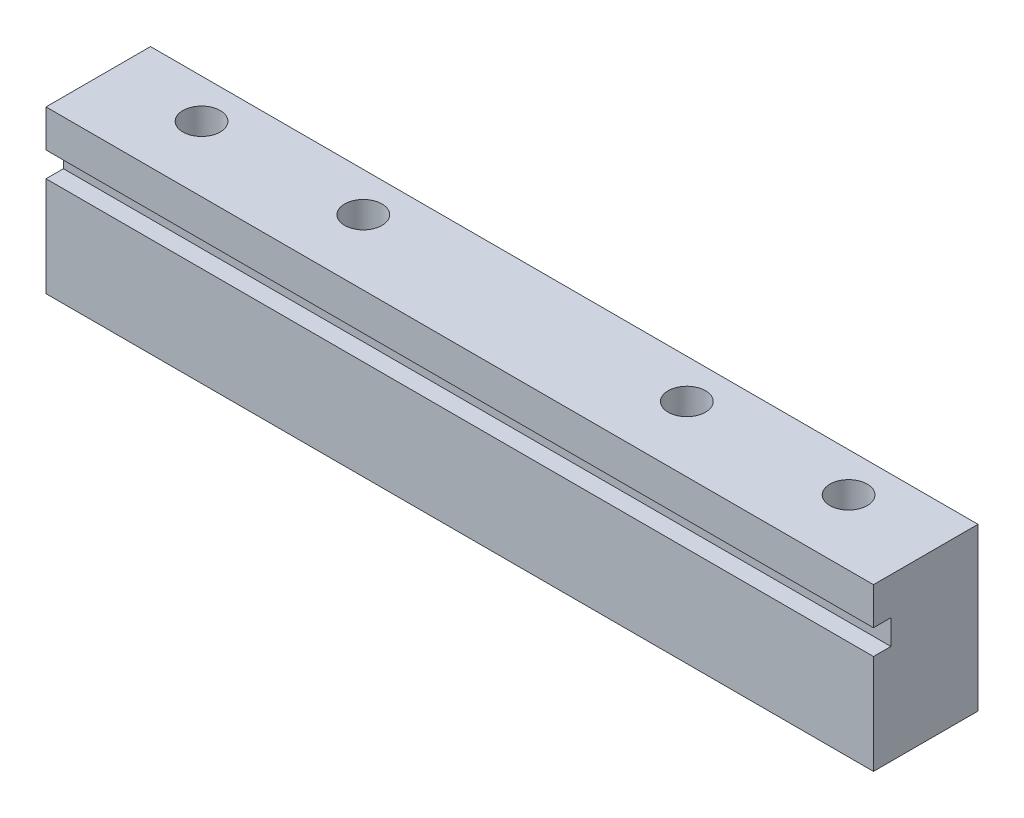
ISO-10303-21;
HEADER;
FILE_DESCRIPTION(('STEP AP214'),'2;1');
FILE_NAME('part.step','',(''),(''),'','','');
FILE_SCHEMA(('AUTOMOTIVE_DESIGN { 1 0 10303 214 1 1 1 1 }'));
ENDSEC;
DATA;
#1=APPLICATION_CONTEXT('core data for automotive mechanical design processes');
#2=APPLICATION_PROTOCOL_DEFINITION('international standard','automotive_design',2000,#1);
#3=PRODUCT_CONTEXT('',#1,'mechanical');
#4=PRODUCT('Part','Part','',(#3));
#5=PRODUCT_RELATED_PRODUCT_CATEGORY('part','',(#4));
#6=PRODUCT_DEFINITION_FORMATION('','',#4);
#7=PRODUCT_DEFINITION_CONTEXT('part definition',#1,'design');
#8=PRODUCT_DEFINITION('design','',#6,#7);
#9=PRODUCT_DEFINITION_SHAPE('','',#8);
#10=(LENGTH_UNIT() NAMED_UNIT(*) SI_UNIT(.MILLI.,.METRE.));
#11=(NAMED_UNIT(*) PLANE_ANGLE_UNIT() SI_UNIT($,.RADIAN.));
#12=(NAMED_UNIT(*) SI_UNIT($,.STERADIAN.) SOLID_ANGLE_UNIT());
#13=UNCERTAINTY_MEASURE_WITH_UNIT(LENGTH_MEASURE(1.E-05),#10,'distance_accuracy_value','');
#14=(GEOMETRIC_REPRESENTATION_CONTEXT(3) GLOBAL_UNCERTAINTY_ASSIGNED_CONTEXT((#13)) GLOBAL_UNIT_ASSIGNED_CONTEXT((#10,
#11,#12)) REPRESENTATION_CONTEXT('',''));
#15=CARTESIAN_POINT('',(0.,0.,0.));
#16=DIRECTION('',(0.,0.,1.));
#17=DIRECTION('',(1.,0.,0.));
#18=AXIS2_PLACEMENT_3D('',#15,#16,#17);
#19=CARTESIAN_POINT('',(-33.2500000000002,13.,4.2));
#20=DIRECTION('',(0.,0.,-1.));
#21=DIRECTION('',(-1.,0.,0.));
#22=AXIS2_PLACEMENT_3D('',#19,#20,#21);
#23=PLANE('',#22);
#24=DIRECTION('',(0.,-1.,0.));
#25=VECTOR('',#24,1.);
#26=CARTESIAN_POINT('',(-33.2500000000002,13.,4.2));
#27=LINE('',#26,#25);
#28=CARTESIAN_POINT('',(-33.2500000000002,13.,4.2));
#29=VERTEX_POINT('',#28);
#30=CARTESIAN_POINT('',(-33.2500000000002,10.,4.2));
#31=VERTEX_POINT('',#30);
#32=EDGE_CURVE('E136',#29,#31,#27,.T.);
#33=ORIENTED_EDGE('',*,*,#32,.T.);
#34=DIRECTION('',(1.,0.,0.));
#35=VECTOR('',#34,1.);
#36=CARTESIAN_POINT('',(-33.2500000000002,10.,4.2));
#37=LINE('',#36,#35);
#38=CARTESIAN_POINT('',(33.2499999999998,10.,4.2));
#39=VERTEX_POINT('',#38);
#40=EDGE_CURVE('E43',#31,#39,#37,.T.);
#41=ORIENTED_EDGE('',*,*,#40,.T.);
#42=DIRECTION('',(0.,-1.,0.));
#43=VECTOR('',#42,1.);
#44=CARTESIAN_POINT('',(33.2499999999998,13.,4.2));
#45=LINE('',#44,#43);
#46=CARTESIAN_POINT('',(33.2499999999998,13.,4.2));
#47=VERTEX_POINT('',#46);
#48=EDGE_CURVE('E128',#47,#39,#45,.T.);
#49=ORIENTED_EDGE('',*,*,#48,.F.);
#50=DIRECTION('',(1.,0.,0.));
#51=VECTOR('',#50,1.);
#52=CARTESIAN_POINT('',(-33.2500000000002,13.,4.2));
#53=LINE('',#52,#51);
#54=EDGE_CURVE('E59',#29,#47,#53,.T.);
#55=ORIENTED_EDGE('',*,*,#54,.F.);
#56=EDGE_LOOP('',(#33,#41,#49,#55));
#57=FACE_BOUND('',#56,.T.);
#58=ADVANCED_FACE('F35',(#57),#23,.F.);
#59=CARTESIAN_POINT('',(33.2499999999998,13.,-4.2));
#60=DIRECTION('',(-1.,0.,0.));
#61=DIRECTION('',(0.,0.,1.));
#62=AXIS2_PLACEMENT_3D('',#59,#60,#61);
#63=PLANE('',#62);
#64=ORIENTED_EDGE('',*,*,#48,.T.);
#65=DIRECTION('',(0.,0.,1.));
#66=VECTOR('',#65,1.);
#67=CARTESIAN_POINT('',(33.2499999999998,10.,4.2));
#68=LINE('',#67,#66);
#69=CARTESIAN_POINT('',(33.2499999999998,10.,2.8));
#70=VERTEX_POINT('',#69);
#71=EDGE_CURVE('E148',#70,#39,#68,.T.);
#72=ORIENTED_EDGE('',*,*,#71,.F.);
#73=DIRECTION('',(0.,1.,0.));
#74=VECTOR('',#73,1.);
#75=CARTESIAN_POINT('',(33.2499999999998,10.,2.8));
#76=LINE('',#75,#74);
#77=CARTESIAN_POINT('',(33.2499999999998,8.,2.8));
#78=VERTEX_POINT('',#77);
#79=EDGE_CURVE('E121',#78,#70,#76,.T.);
#80=ORIENTED_EDGE('',*,*,#79,.F.);
#81=DIRECTION('',(0.,0.,-1.));
#82=VECTOR('',#81,1.);
#83=CARTESIAN_POINT('',(33.2499999999998,8.,4.2));
#84=LINE('',#83,#82);
#85=CARTESIAN_POINT('',(33.2499999999998,8.,4.2));
#86=VERTEX_POINT('',#85);
#87=EDGE_CURVE('E112',#86,#78,#84,.T.);
#88=ORIENTED_EDGE('',*,*,#87,.F.);
#89=CARTESIAN_POINT('',(33.2499999999998,0.,4.2));
#90=VERTEX_POINT('',#89);
#91=EDGE_CURVE('E81',#86,#90,#45,.T.);
#92=ORIENTED_EDGE('',*,*,#91,.T.);
#93=DIRECTION('',(0.,0.,-1.));
#94=VECTOR('',#93,1.);
#95=CARTESIAN_POINT('',(33.2499999999998,0.,-4.2));
#96=LINE('',#95,#94);
#97=CARTESIAN_POINT('',(33.2499999999998,0.,-4.2));
#98=VERTEX_POINT('',#97);
#99=EDGE_CURVE('E159',#90,#98,#96,.T.);
#100=ORIENTED_EDGE('',*,*,#99,.T.);
#101=DIRECTION('',(0.,-1.,0.));
#102=VECTOR('',#101,1.);
#103=CARTESIAN_POINT('',(33.2499999999998,13.,-4.2));
#104=LINE('',#103,#102);
#105=CARTESIAN_POINT('',(33.2499999999998,13.,-4.2));
#106=VERTEX_POINT('',#105);
#107=EDGE_CURVE('E116',#106,#98,#104,.T.);
#108=ORIENTED_EDGE('',*,*,#107,.F.);
#109=DIRECTION('',(0.,0.,-1.));
#110=VECTOR('',#109,1.);
#111=CARTESIAN_POINT('',(33.2499999999998,13.,-4.2));
#112=LINE('',#111,#110);
#113=EDGE_CURVE('E150',#47,#106,#112,.T.);
#114=ORIENTED_EDGE('',*,*,#113,.F.);
#115=EDGE_LOOP('',(#64,#72,#80,#88,#92,#100,#108,#114));
#116=FACE_BOUND('',#115,.T.);
#117=ADVANCED_FACE('F37',(#116),#63,.F.);
#118=CARTESIAN_POINT('',(-33.2500000000002,13.,-4.2));
#119=DIRECTION('',(0.,0.,1.));
#120=DIRECTION('',(1.,0.,0.));
#121=AXIS2_PLACEMENT_3D('',#118,#119,#120);
#122=PLANE('',#121);
#123=DIRECTION('',(-1.,0.,0.));
#124=VECTOR('',#123,1.);
#125=CARTESIAN_POINT('',(-33.2500000000002,0.,-4.2));
#126=LINE('',#125,#124);
#127=CARTESIAN_POINT('',(-33.2500000000002,0.,-4.2));
#128=VERTEX_POINT('',#127);
#129=EDGE_CURVE('E161',#98,#128,#126,.T.);
#130=ORIENTED_EDGE('',*,*,#129,.T.);
#131=DIRECTION('',(0.,-1.,0.));
#132=VECTOR('',#131,1.);
#133=CARTESIAN_POINT('',(-33.2500000000002,13.,-4.2));
#134=LINE('',#133,#132);
#135=CARTESIAN_POINT('',(-33.2500000000002,13.,-4.2));
#136=VERTEX_POINT('',#135);
#137=EDGE_CURVE('E139',#136,#128,#134,.T.);
#138=ORIENTED_EDGE('',*,*,#137,.F.);
#139=DIRECTION('',(-1.,0.,0.));
#140=VECTOR('',#139,1.);
#141=CARTESIAN_POINT('',(-33.2500000000002,13.,-4.2));
#142=LINE('',#141,#140);
#143=EDGE_CURVE('E89',#106,#136,#142,.T.);
#144=ORIENTED_EDGE('',*,*,#143,.F.);
#145=ORIENTED_EDGE('',*,*,#107,.T.);
#146=EDGE_LOOP('',(#130,#138,#144,#145));
#147=FACE_BOUND('',#146,.T.);
#148=ADVANCED_FACE('F169',(#147),#122,.F.);
#149=CARTESIAN_POINT('',(-33.2500000000002,13.,-4.2));
#150=DIRECTION('',(1.,0.,0.));
#151=DIRECTION('',(0.,0.,-1.));
#152=AXIS2_PLACEMENT_3D('',#149,#150,#151);
#153=PLANE('',#152);
#154=DIRECTION('',(0.,1.,0.));
#155=VECTOR('',#154,1.);
#156=CARTESIAN_POINT('',(-33.2500000000002,13.,2.8));
#157=LINE('',#156,#155);
#158=CARTESIAN_POINT('',(-33.2500000000002,8.,2.8));
#159=VERTEX_POINT('',#158);
#160=CARTESIAN_POINT('',(-33.2500000000002,10.,2.8));
#161=VERTEX_POINT('',#160);
#162=EDGE_CURVE('E11',#159,#161,#157,.T.);
#163=ORIENTED_EDGE('',*,*,#162,.T.);
#164=DIRECTION('',(0.,0.,1.));
#165=VECTOR('',#164,1.);
#166=CARTESIAN_POINT('',(-33.2500000000002,10.,-4.2));
#167=LINE('',#166,#165);
#168=EDGE_CURVE('E155',#161,#31,#167,.T.);
#169=ORIENTED_EDGE('',*,*,#168,.T.);
#170=ORIENTED_EDGE('',*,*,#32,.F.);
#171=DIRECTION('',(0.,0.,1.));
#172=VECTOR('',#171,1.);
#173=CARTESIAN_POINT('',(-33.2500000000002,13.,-4.2));
#174=LINE('',#173,#172);
#175=EDGE_CURVE('E131',#136,#29,#174,.T.);
#176=ORIENTED_EDGE('',*,*,#175,.F.);
#177=ORIENTED_EDGE('',*,*,#137,.T.);
#178=DIRECTION('',(0.,0.,1.));
#179=VECTOR('',#178,1.);
#180=CARTESIAN_POINT('',(-33.2500000000002,0.,-4.2));
#181=LINE('',#180,#179);
#182=CARTESIAN_POINT('',(-33.2500000000002,0.,4.2));
#183=VERTEX_POINT('',#182);
#184=EDGE_CURVE('E153',#128,#183,#181,.T.);
#185=ORIENTED_EDGE('',*,*,#184,.T.);
#186=CARTESIAN_POINT('',(-33.2500000000002,8.,4.2));
#187=VERTEX_POINT('',#186);
#188=EDGE_CURVE('E130',#187,#183,#27,.T.);
#189=ORIENTED_EDGE('',*,*,#188,.F.);
#190=DIRECTION('',(0.,0.,-1.));
#191=VECTOR('',#190,1.);
#192=CARTESIAN_POINT('',(-33.2500000000002,8.,-4.2));
#193=LINE('',#192,#191);
#194=EDGE_CURVE('E50',#187,#159,#193,.T.);
#195=ORIENTED_EDGE('',*,*,#194,.T.);
#196=EDGE_LOOP('',(#163,#169,#170,#176,#177,#185,#189,#195));
#197=FACE_BOUND('',#196,.T.);
#198=ADVANCED_FACE('F165',(#197),#153,.F.);
#199=ORIENTED_EDGE('',*,*,#91,.F.);
#200=DIRECTION('',(-1.,0.,0.));
#201=VECTOR('',#200,1.);
#202=CARTESIAN_POINT('',(-33.2500000000002,8.,4.2));
#203=LINE('',#202,#201);
#204=EDGE_CURVE('E110',#86,#187,#203,.T.);
#205=ORIENTED_EDGE('',*,*,#204,.T.);
#206=ORIENTED_EDGE('',*,*,#188,.T.);
#207=DIRECTION('',(1.,0.,0.));
#208=VECTOR('',#207,1.);
#209=CARTESIAN_POINT('',(-33.2500000000002,0.,4.2));
#210=LINE('',#209,#208);
#211=EDGE_CURVE('E126',#183,#90,#210,.T.);
#212=ORIENTED_EDGE('',*,*,#211,.T.);
#213=EDGE_LOOP('',(#199,#205,#206,#212));
#214=FACE_BOUND('',#213,.T.);
#215=ADVANCED_FACE('F124',(#214),#23,.F.);
#216=CARTESIAN_POINT('',(0.,13.,0.));
#217=DIRECTION('',(0.,1.,0.));
#218=DIRECTION('',(0.,0.,1.));
#219=AXIS2_PLACEMENT_3D('',#216,#217,#218);
#220=PLANE('',#219);
#221=CARTESIAN_POINT('',(-26.0000000000002,13.,-1.05));
#222=DIRECTION('',(0.,-1.,0.));
#223=DIRECTION('',(0.,0.,-1.));
#224=AXIS2_PLACEMENT_3D('',#221,#222,#223);
#225=CIRCLE('',#224,1.5);
#226=CARTESIAN_POINT('',(-26.0000000000002,13.,-2.55));
#227=VERTEX_POINT('',#226);
#228=EDGE_CURVE('E122',#227,#227,#225,.T.);
#229=ORIENTED_EDGE('',*,*,#228,.T.);
#230=EDGE_LOOP('',(#229));
#231=FACE_BOUND('',#230,.T.);
#232=CARTESIAN_POINT('',(12.9999999999998,13.,-1.05));
#233=DIRECTION('',(0.,-1.,0.));
#234=DIRECTION('',(0.,0.,-1.));
#235=AXIS2_PLACEMENT_3D('',#232,#233,#234);
#236=CIRCLE('',#235,1.5);
#237=CARTESIAN_POINT('',(12.9999999999998,13.,-2.55));
#238=VERTEX_POINT('',#237);
#239=EDGE_CURVE('E233',#238,#238,#236,.T.);
#240=ORIENTED_EDGE('',*,*,#239,.T.);
#241=EDGE_LOOP('',(#240));
#242=FACE_BOUND('',#241,.T.);
#243=CARTESIAN_POINT('',(25.9999999999998,13.,-1.04999999999999));
#244=DIRECTION('',(0.,-1.,0.));
#245=DIRECTION('',(0.,0.,-1.));
#246=AXIS2_PLACEMENT_3D('',#243,#244,#245);
#247=CIRCLE('',#246,1.5);
#248=CARTESIAN_POINT('',(25.9999999999998,13.,-2.54999999999999));
#249=VERTEX_POINT('',#248);
#250=EDGE_CURVE('E242',#249,#249,#247,.T.);
#251=ORIENTED_EDGE('',*,*,#250,.T.);
#252=EDGE_LOOP('',(#251));
#253=FACE_BOUND('',#252,.T.);
#254=CARTESIAN_POINT('',(-13.0000000000002,13.,-1.05));
#255=DIRECTION('',(0.,-1.,0.));
#256=DIRECTION('',(0.,0.,-1.));
#257=AXIS2_PLACEMENT_3D('',#254,#255,#256);
#258=CIRCLE('',#257,1.5);
#259=CARTESIAN_POINT('',(-13.0000000000002,13.,-2.55));
#260=VERTEX_POINT('',#259);
#261=EDGE_CURVE('E226',#260,#260,#258,.T.);
#262=ORIENTED_EDGE('',*,*,#261,.T.);
#263=EDGE_LOOP('',(#262));
#264=FACE_BOUND('',#263,.T.);
#265=ORIENTED_EDGE('',*,*,#113,.T.);
#266=ORIENTED_EDGE('',*,*,#143,.T.);
#267=ORIENTED_EDGE('',*,*,#175,.T.);
#268=ORIENTED_EDGE('',*,*,#54,.T.);
#269=EDGE_LOOP('',(#265,#266,#267,#268));
#270=FACE_BOUND('',#269,.T.);
#271=ADVANCED_FACE('F182',(#231,#242,#253,#264,#270),#220,.T.);
#272=CARTESIAN_POINT('',(0.,0.,0.));
#273=DIRECTION('',(0.,1.,0.));
#274=DIRECTION('',(0.,0.,1.));
#275=AXIS2_PLACEMENT_3D('',#272,#273,#274);
#276=PLANE('',#275);
#277=CARTESIAN_POINT('',(-26.0000000000002,0.,-1.05));
#278=DIRECTION('',(0.,-1.,0.));
#279=DIRECTION('',(0.,0.,-1.));
#280=AXIS2_PLACEMENT_3D('',#277,#278,#279);
#281=CIRCLE('',#280,1.5);
#282=CARTESIAN_POINT('',(-26.0000000000002,0.,-2.55));
#283=VERTEX_POINT('',#282);
#284=EDGE_CURVE('E225',#283,#283,#281,.T.);
#285=ORIENTED_EDGE('',*,*,#284,.F.);
#286=EDGE_LOOP('',(#285));
#287=FACE_BOUND('',#286,.T.);
#288=CARTESIAN_POINT('',(12.9999999999998,0.,-1.05));
#289=DIRECTION('',(0.,-1.,0.));
#290=DIRECTION('',(0.,0.,-1.));
#291=AXIS2_PLACEMENT_3D('',#288,#289,#290);
#292=CIRCLE('',#291,1.5);
#293=CARTESIAN_POINT('',(12.9999999999998,0.,-2.55));
#294=VERTEX_POINT('',#293);
#295=EDGE_CURVE('E237',#294,#294,#292,.T.);
#296=ORIENTED_EDGE('',*,*,#295,.F.);
#297=EDGE_LOOP('',(#296));
#298=FACE_BOUND('',#297,.T.);
#299=CARTESIAN_POINT('',(25.9999999999998,0.,-1.04999999999999));
#300=DIRECTION('',(0.,-1.,0.));
#301=DIRECTION('',(0.,0.,-1.));
#302=AXIS2_PLACEMENT_3D('',#299,#300,#301);
#303=CIRCLE('',#302,1.5);
#304=CARTESIAN_POINT('',(25.9999999999998,0.,-2.54999999999999));
#305=VERTEX_POINT('',#304);
#306=EDGE_CURVE('E236',#305,#305,#303,.T.);
#307=ORIENTED_EDGE('',*,*,#306,.F.);
#308=EDGE_LOOP('',(#307));
#309=FACE_BOUND('',#308,.T.);
#310=CARTESIAN_POINT('',(-13.0000000000002,0.,-1.05));
#311=DIRECTION('',(0.,-1.,0.));
#312=DIRECTION('',(0.,0.,-1.));
#313=AXIS2_PLACEMENT_3D('',#310,#311,#312);
#314=CIRCLE('',#313,1.5);
#315=CARTESIAN_POINT('',(-13.0000000000002,0.,-2.55));
#316=VERTEX_POINT('',#315);
#317=EDGE_CURVE('E230',#316,#316,#314,.T.);
#318=ORIENTED_EDGE('',*,*,#317,.F.);
#319=EDGE_LOOP('',(#318));
#320=FACE_BOUND('',#319,.T.);
#321=ORIENTED_EDGE('',*,*,#99,.F.);
#322=ORIENTED_EDGE('',*,*,#211,.F.);
#323=ORIENTED_EDGE('',*,*,#184,.F.);
#324=ORIENTED_EDGE('',*,*,#129,.F.);
#325=EDGE_LOOP('',(#321,#322,#323,#324));
#326=FACE_BOUND('',#325,.T.);
#327=ADVANCED_FACE('F168',(#287,#298,#309,#320,#326),#276,.F.);
#328=CARTESIAN_POINT('',(-70.7500000000002,10.,2.8));
#329=DIRECTION('',(0.,0.,-1.));
#330=DIRECTION('',(-1.,0.,0.));
#331=AXIS2_PLACEMENT_3D('',#328,#329,#330);
#332=PLANE('',#331);
#333=DIRECTION('',(1.,0.,0.));
#334=VECTOR('',#333,1.);
#335=CARTESIAN_POINT('',(-70.7500000000002,8.,2.8));
#336=LINE('',#335,#334);
#337=EDGE_CURVE('E249',#159,#78,#336,.T.);
#338=ORIENTED_EDGE('',*,*,#337,.T.);
#339=ORIENTED_EDGE('',*,*,#79,.T.);
#340=DIRECTION('',(1.,0.,0.));
#341=VECTOR('',#340,1.);
#342=CARTESIAN_POINT('',(-70.7500000000002,10.,2.8));
#343=LINE('',#342,#341);
#344=EDGE_CURVE('E250',#161,#70,#343,.T.);
#345=ORIENTED_EDGE('',*,*,#344,.F.);
#346=ORIENTED_EDGE('',*,*,#162,.F.);
#347=EDGE_LOOP('',(#338,#339,#345,#346));
#348=FACE_BOUND('',#347,.T.);
#349=ADVANCED_FACE('F191',(#348),#332,.F.);
#350=CARTESIAN_POINT('',(-70.7500000000002,10.,4.2));
#351=DIRECTION('',(0.,1.,0.));
#352=DIRECTION('',(0.,0.,1.));
#353=AXIS2_PLACEMENT_3D('',#350,#351,#352);
#354=PLANE('',#353);
#355=ORIENTED_EDGE('',*,*,#344,.T.);
#356=ORIENTED_EDGE('',*,*,#71,.T.);
#357=ORIENTED_EDGE('',*,*,#40,.F.);
#358=ORIENTED_EDGE('',*,*,#168,.F.);
#359=EDGE_LOOP('',(#355,#356,#357,#358));
#360=FACE_BOUND('',#359,.T.);
#361=ADVANCED_FACE('F199',(#360),#354,.F.);
#362=CARTESIAN_POINT('',(-70.7500000000002,8.,4.2));
#363=DIRECTION('',(0.,-1.,0.));
#364=DIRECTION('',(0.,0.,-1.));
#365=AXIS2_PLACEMENT_3D('',#362,#363,#364);
#366=PLANE('',#365);
#367=ORIENTED_EDGE('',*,*,#204,.F.);
#368=ORIENTED_EDGE('',*,*,#87,.T.);
#369=ORIENTED_EDGE('',*,*,#337,.F.);
#370=ORIENTED_EDGE('',*,*,#194,.F.);
#371=EDGE_LOOP('',(#367,#368,#369,#370));
#372=FACE_BOUND('',#371,.T.);
#373=ADVANCED_FACE('F111',(#372),#366,.F.);
#374=CARTESIAN_POINT('',(-13.0000000000002,13.,-1.05));
#375=DIRECTION('',(0.,-1.,0.));
#376=DIRECTION('',(0.,0.,-1.));
#377=AXIS2_PLACEMENT_3D('',#374,#375,#376);
#378=CYLINDRICAL_SURFACE('',#377,1.5);
#379=CARTESIAN_POINT('',(-13.0000000000002,13.,-2.55));
#380=CARTESIAN_POINT('',(-13.0000000000002,12.8645833333333,-2.55));
#381=CARTESIAN_POINT('',(-13.0000000000002,12.7291666666667,-2.55));
#382=CARTESIAN_POINT('',(-13.0000000000002,12.4583333333333,-2.55));
#383=CARTESIAN_POINT('',(-13.0000000000002,12.3229166666667,-2.55));
#384=CARTESIAN_POINT('',(-13.0000000000002,12.0520833333333,-2.55));
#385=CARTESIAN_POINT('',(-13.0000000000002,11.9166666666667,-2.55));
#386=CARTESIAN_POINT('',(-13.0000000000002,11.6458333333333,-2.55));
#387=CARTESIAN_POINT('',(-13.0000000000002,11.5104166666667,-2.55));
#388=CARTESIAN_POINT('',(-13.0000000000002,11.2395833333333,-2.55));
#389=CARTESIAN_POINT('',(-13.0000000000002,11.1041666666667,-2.55));
#390=CARTESIAN_POINT('',(-13.0000000000002,10.8333333333333,-2.55));
#391=CARTESIAN_POINT('',(-13.0000000000002,10.6979166666667,-2.55));
#392=CARTESIAN_POINT('',(-13.0000000000002,10.4270833333333,-2.55));
#393=CARTESIAN_POINT('',(-13.0000000000002,10.2916666666667,-2.55));
#394=CARTESIAN_POINT('',(-13.0000000000002,10.0208333333333,-2.55));
#395=CARTESIAN_POINT('',(-13.0000000000002,9.88541666666667,-2.55));
#396=CARTESIAN_POINT('',(-13.0000000000002,9.61458333333333,-2.55));
#397=CARTESIAN_POINT('',(-13.0000000000002,9.47916666666667,-2.55));
#398=CARTESIAN_POINT('',(-13.0000000000002,9.20833333333333,-2.55));
#399=CARTESIAN_POINT('',(-13.0000000000002,9.07291666666667,-2.55));
#400=CARTESIAN_POINT('',(-13.0000000000002,8.80208333333333,-2.55));
#401=CARTESIAN_POINT('',(-13.0000000000002,8.66666666666667,-2.55));
#402=CARTESIAN_POINT('',(-13.0000000000002,8.39583333333333,-2.55));
#403=CARTESIAN_POINT('',(-13.0000000000002,8.26041666666667,-2.55));
#404=CARTESIAN_POINT('',(-13.0000000000002,7.98958333333333,-2.55));
#405=CARTESIAN_POINT('',(-13.0000000000002,7.85416666666667,-2.55));
#406=CARTESIAN_POINT('',(-13.0000000000002,7.58333333333333,-2.55));
#407=CARTESIAN_POINT('',(-13.0000000000002,7.44791666666667,-2.55));
#408=CARTESIAN_POINT('',(-13.0000000000002,7.17708333333333,-2.55));
#409=CARTESIAN_POINT('',(-13.0000000000002,7.04166666666667,-2.55));
#410=CARTESIAN_POINT('',(-13.0000000000002,6.77083333333333,-2.55));
#411=CARTESIAN_POINT('',(-13.0000000000002,6.63541666666667,-2.55));
#412=CARTESIAN_POINT('',(-13.0000000000002,6.36458333333333,-2.55));
#413=CARTESIAN_POINT('',(-13.0000000000002,6.22916666666667,-2.55));
#414=CARTESIAN_POINT('',(-13.0000000000002,5.95833333333333,-2.55));
#415=CARTESIAN_POINT('',(-13.0000000000002,5.82291666666667,-2.55));
#416=CARTESIAN_POINT('',(-13.0000000000002,5.55208333333333,-2.55));
#417=CARTESIAN_POINT('',(-13.0000000000002,5.41666666666667,-2.55));
#418=CARTESIAN_POINT('',(-13.0000000000002,5.14583333333333,-2.55));
#419=CARTESIAN_POINT('',(-13.0000000000002,5.01041666666667,-2.55));
#420=CARTESIAN_POINT('',(-13.0000000000002,4.73958333333333,-2.55));
#421=CARTESIAN_POINT('',(-13.0000000000002,4.60416666666667,-2.55));
#422=CARTESIAN_POINT('',(-13.0000000000002,4.33333333333333,-2.55));
#423=CARTESIAN_POINT('',(-13.0000000000002,4.19791666666667,-2.55));
#424=CARTESIAN_POINT('',(-13.0000000000002,3.92708333333333,-2.55));
#425=CARTESIAN_POINT('',(-13.0000000000002,3.79166666666667,-2.55));
#426=CARTESIAN_POINT('',(-13.0000000000002,3.52083333333333,-2.55));
#427=CARTESIAN_POINT('',(-13.0000000000002,3.38541666666667,-2.55));
#428=CARTESIAN_POINT('',(-13.0000000000002,3.11458333333333,-2.55));
#429=CARTESIAN_POINT('',(-13.0000000000002,2.97916666666667,-2.55));
#430=CARTESIAN_POINT('',(-13.0000000000002,2.70833333333333,-2.55));
#431=CARTESIAN_POINT('',(-13.0000000000002,2.57291666666667,-2.55));
#432=CARTESIAN_POINT('',(-13.0000000000002,2.30208333333333,-2.55));
#433=CARTESIAN_POINT('',(-13.0000000000002,2.16666666666667,-2.55));
#434=CARTESIAN_POINT('',(-13.0000000000002,1.89583333333333,-2.55));
#435=CARTESIAN_POINT('',(-13.0000000000002,1.76041666666667,-2.55));
#436=CARTESIAN_POINT('',(-13.0000000000002,1.48958333333333,-2.55));
#437=CARTESIAN_POINT('',(-13.0000000000002,1.35416666666667,-2.55));
#438=CARTESIAN_POINT('',(-13.0000000000002,1.08333333333333,-2.55));
#439=CARTESIAN_POINT('',(-13.0000000000002,0.947916666666667,-2.55));
#440=CARTESIAN_POINT('',(-13.0000000000002,0.677083333333334,-2.55));
#441=CARTESIAN_POINT('',(-13.0000000000002,0.541666666666667,-2.55));
#442=CARTESIAN_POINT('',(-13.0000000000002,0.270833333333334,-2.55));
#443=CARTESIAN_POINT('',(-13.0000000000002,0.135416666666667,-2.55));
#444=CARTESIAN_POINT('',(-13.0000000000002,0.,-2.55));
#445=B_SPLINE_CURVE_WITH_KNOTS('',3,(#379,#380,#381,#382,#383,#384,#385,#386,#387,#388,#389,
#390,#391,#392,#393,#394,#395,#396,#397,#398,#399,#400,#401,#402,#403,#404,#405,#406,#407,#408,
#409,#410,#411,#412,#413,#414,#415,#416,#417,#418,#419,#420,#421,#422,#423,#424,#425,#426,#427,
#428,#429,#430,#431,#432,#433,#434,#435,#436,#437,#438,#439,#440,#441,#442,#443,#444),
.UNSPECIFIED.,.F.,.F.,(4,2,2,2,2,2,2,2,2,2,2,2,2,2,2,2,2,2,2,2,2,2,2,2,2,2,2,2,2,2,2,2,4),(0.,
0.40625,0.812500000000001,1.21875,1.625,2.03125,2.4375,2.84375,3.25,3.65625,4.0625,4.46875,
4.875,5.28125,5.6875,6.09375,6.5,6.90625,7.3125,7.71875,8.125,8.53125,8.9375,9.34375,9.75,
10.15625,10.5625,10.96875,11.375,11.78125,12.1875,12.59375,13.),.UNSPECIFIED.);
#446=EDGE_CURVE('BSEAM198',#260,#316,#445,.T.);
#447=ORIENTED_EDGE('',*,*,#261,.F.);
#448=ORIENTED_EDGE('',*,*,#317,.T.);
#449=ORIENTED_EDGE('',*,*,#446,.T.);
#450=ORIENTED_EDGE('',*,*,#446,.F.);
#451=EDGE_LOOP('',(#447,#449,#448,#450));
#452=FACE_BOUND('',#451,.T.);
#453=ADVANCED_FACE('F198',(#452),#378,.F.);
#454=CARTESIAN_POINT('',(25.9999999999998,13.,-1.04999999999999));
#455=DIRECTION('',(0.,-1.,0.));
#456=DIRECTION('',(0.,0.,-1.));
#457=AXIS2_PLACEMENT_3D('',#454,#455,#456);
#458=CYLINDRICAL_SURFACE('',#457,1.5);
#459=CARTESIAN_POINT('',(25.9999999999998,13.,-2.54999999999999));
#460=CARTESIAN_POINT('',(25.9999999999998,12.8645833333333,-2.54999999999999));
#461=CARTESIAN_POINT('',(25.9999999999998,12.7291666666667,-2.54999999999999));
#462=CARTESIAN_POINT('',(25.9999999999998,12.4583333333333,-2.54999999999999));
#463=CARTESIAN_POINT('',(25.9999999999998,12.3229166666667,-2.54999999999999));
#464=CARTESIAN_POINT('',(25.9999999999998,12.0520833333333,-2.54999999999999));
#465=CARTESIAN_POINT('',(25.9999999999998,11.9166666666667,-2.54999999999999));
#466=CARTESIAN_POINT('',(25.9999999999998,11.6458333333333,-2.54999999999999));
#467=CARTESIAN_POINT('',(25.9999999999998,11.5104166666667,-2.54999999999999));
#468=CARTESIAN_POINT('',(25.9999999999998,11.2395833333333,-2.54999999999999));
#469=CARTESIAN_POINT('',(25.9999999999998,11.1041666666667,-2.54999999999999));
#470=CARTESIAN_POINT('',(25.9999999999998,10.8333333333333,-2.54999999999999));
#471=CARTESIAN_POINT('',(25.9999999999998,10.6979166666667,-2.54999999999999));
#472=CARTESIAN_POINT('',(25.9999999999998,10.4270833333333,-2.54999999999999));
#473=CARTESIAN_POINT('',(25.9999999999998,10.2916666666667,-2.54999999999999));
#474=CARTESIAN_POINT('',(25.9999999999998,10.0208333333333,-2.54999999999999));
#475=CARTESIAN_POINT('',(25.9999999999998,9.88541666666667,-2.54999999999999));
#476=CARTESIAN_POINT('',(25.9999999999998,9.61458333333333,-2.54999999999999));
#477=CARTESIAN_POINT('',(25.9999999999998,9.47916666666667,-2.54999999999999));
#478=CARTESIAN_POINT('',(25.9999999999998,9.20833333333333,-2.54999999999999));
#479=CARTESIAN_POINT('',(25.9999999999998,9.07291666666667,-2.54999999999999));
#480=CARTESIAN_POINT('',(25.9999999999998,8.80208333333333,-2.54999999999999));
#481=CARTESIAN_POINT('',(25.9999999999998,8.66666666666667,-2.54999999999999));
#482=CARTESIAN_POINT('',(25.9999999999998,8.39583333333333,-2.54999999999999));
#483=CARTESIAN_POINT('',(25.9999999999998,8.26041666666667,-2.54999999999999));
#484=CARTESIAN_POINT('',(25.9999999999998,7.98958333333333,-2.54999999999999));
#485=CARTESIAN_POINT('',(25.9999999999998,7.85416666666667,-2.54999999999999));
#486=CARTESIAN_POINT('',(25.9999999999998,7.58333333333333,-2.54999999999999));
#487=CARTESIAN_POINT('',(25.9999999999998,7.44791666666667,-2.54999999999999));
#488=CARTESIAN_POINT('',(25.9999999999998,7.17708333333333,-2.54999999999999));
#489=CARTESIAN_POINT('',(25.9999999999998,7.04166666666667,-2.54999999999999));
#490=CARTESIAN_POINT('',(25.9999999999998,6.77083333333333,-2.54999999999999));
#491=CARTESIAN_POINT('',(25.9999999999998,6.63541666666667,-2.54999999999999));
#492=CARTESIAN_POINT('',(25.9999999999998,6.36458333333333,-2.54999999999999));
#493=CARTESIAN_POINT('',(25.9999999999998,6.22916666666667,-2.54999999999999));
#494=CARTESIAN_POINT('',(25.9999999999998,5.95833333333333,-2.54999999999999));
#495=CARTESIAN_POINT('',(25.9999999999998,5.82291666666667,-2.54999999999999));
#496=CARTESIAN_POINT('',(25.9999999999998,5.55208333333333,-2.54999999999999));
#497=CARTESIAN_POINT('',(25.9999999999998,5.41666666666667,-2.54999999999999));
#498=CARTESIAN_POINT('',(25.9999999999998,5.14583333333333,-2.54999999999999));
#499=CARTESIAN_POINT('',(25.9999999999998,5.01041666666667,-2.54999999999999));
#500=CARTESIAN_POINT('',(25.9999999999998,4.73958333333333,-2.54999999999999));
#501=CARTESIAN_POINT('',(25.9999999999998,4.60416666666667,-2.54999999999999));
#502=CARTESIAN_POINT('',(25.9999999999998,4.33333333333333,-2.54999999999999));
#503=CARTESIAN_POINT('',(25.9999999999998,4.19791666666667,-2.54999999999999));
#504=CARTESIAN_POINT('',(25.9999999999998,3.92708333333333,-2.54999999999999));
#505=CARTESIAN_POINT('',(25.9999999999998,3.79166666666667,-2.54999999999999));
#506=CARTESIAN_POINT('',(25.9999999999998,3.52083333333333,-2.54999999999999));
#507=CARTESIAN_POINT('',(25.9999999999998,3.38541666666667,-2.54999999999999));
#508=CARTESIAN_POINT('',(25.9999999999998,3.11458333333333,-2.54999999999999));
#509=CARTESIAN_POINT('',(25.9999999999998,2.97916666666667,-2.54999999999999));
#510=CARTESIAN_POINT('',(25.9999999999998,2.70833333333333,-2.54999999999999));
#511=CARTESIAN_POINT('',(25.9999999999998,2.57291666666667,-2.54999999999999));
#512=CARTESIAN_POINT('',(25.9999999999998,2.30208333333333,-2.54999999999999));
#513=CARTESIAN_POINT('',(25.9999999999998,2.16666666666667,-2.54999999999999));
#514=CARTESIAN_POINT('',(25.9999999999998,1.89583333333333,-2.54999999999999));
#515=CARTESIAN_POINT('',(25.9999999999998,1.76041666666667,-2.54999999999999));
#516=CARTESIAN_POINT('',(25.9999999999998,1.48958333333333,-2.54999999999999));
#517=CARTESIAN_POINT('',(25.9999999999998,1.35416666666667,-2.54999999999999));
#518=CARTESIAN_POINT('',(25.9999999999998,1.08333333333333,-2.54999999999999));
#519=CARTESIAN_POINT('',(25.9999999999998,0.947916666666667,-2.54999999999999));
#520=CARTESIAN_POINT('',(25.9999999999998,0.677083333333334,-2.54999999999999));
#521=CARTESIAN_POINT('',(25.9999999999998,0.541666666666667,-2.54999999999999));
#522=CARTESIAN_POINT('',(25.9999999999998,0.270833333333334,-2.54999999999999));
#523=CARTESIAN_POINT('',(25.9999999999998,0.135416666666667,-2.54999999999999));
#524=CARTESIAN_POINT('',(25.9999999999998,0.,-2.54999999999999));
#525=B_SPLINE_CURVE_WITH_KNOTS('',3,(#459,#460,#461,#462,#463,#464,#465,#466,#467,#468,#469,
#470,#471,#472,#473,#474,#475,#476,#477,#478,#479,#480,#481,#482,#483,#484,#485,#486,#487,#488,
#489,#490,#491,#492,#493,#494,#495,#496,#497,#498,#499,#500,#501,#502,#503,#504,#505,#506,#507,
#508,#509,#510,#511,#512,#513,#514,#515,#516,#517,#518,#519,#520,#521,#522,#523,#524),
.UNSPECIFIED.,.F.,.F.,(4,2,2,2,2,2,2,2,2,2,2,2,2,2,2,2,2,2,2,2,2,2,2,2,2,2,2,2,2,2,2,2,4),(0.,
0.40625,0.812500000000001,1.21875,1.625,2.03125,2.4375,2.84375,3.25,3.65625,4.0625,4.46875,
4.875,5.28125,5.6875,6.09375,6.5,6.90625,7.3125,7.71875,8.125,8.53125,8.9375,9.34375,9.75,
10.15625,10.5625,10.96875,11.375,11.78125,12.1875,12.59375,13.),.UNSPECIFIED.);
#526=EDGE_CURVE('BSEAM205',#249,#305,#525,.T.);
#527=ORIENTED_EDGE('',*,*,#250,.F.);
#528=ORIENTED_EDGE('',*,*,#306,.T.);
#529=ORIENTED_EDGE('',*,*,#526,.T.);
#530=ORIENTED_EDGE('',*,*,#526,.F.);
#531=EDGE_LOOP('',(#527,#529,#528,#530));
#532=FACE_BOUND('',#531,.T.);
#533=ADVANCED_FACE('F205',(#532),#458,.F.);
#534=CARTESIAN_POINT('',(12.9999999999998,13.,-1.05));
#535=DIRECTION('',(0.,-1.,0.));
#536=DIRECTION('',(0.,0.,-1.));
#537=AXIS2_PLACEMENT_3D('',#534,#535,#536);
#538=CYLINDRICAL_SURFACE('',#537,1.5);
#539=CARTESIAN_POINT('',(12.9999999999998,13.,-2.55));
#540=CARTESIAN_POINT('',(12.9999999999998,12.8645833333333,-2.55));
#541=CARTESIAN_POINT('',(12.9999999999998,12.7291666666667,-2.55));
#542=CARTESIAN_POINT('',(12.9999999999998,12.4583333333333,-2.55));
#543=CARTESIAN_POINT('',(12.9999999999998,12.3229166666667,-2.55));
#544=CARTESIAN_POINT('',(12.9999999999998,12.0520833333333,-2.55));
#545=CARTESIAN_POINT('',(12.9999999999998,11.9166666666667,-2.55));
#546=CARTESIAN_POINT('',(12.9999999999998,11.6458333333333,-2.55));
#547=CARTESIAN_POINT('',(12.9999999999998,11.5104166666667,-2.55));
#548=CARTESIAN_POINT('',(12.9999999999998,11.2395833333333,-2.55));
#549=CARTESIAN_POINT('',(12.9999999999998,11.1041666666667,-2.55));
#550=CARTESIAN_POINT('',(12.9999999999998,10.8333333333333,-2.55));
#551=CARTESIAN_POINT('',(12.9999999999998,10.6979166666667,-2.55));
#552=CARTESIAN_POINT('',(12.9999999999998,10.4270833333333,-2.55));
#553=CARTESIAN_POINT('',(12.9999999999998,10.2916666666667,-2.55));
#554=CARTESIAN_POINT('',(12.9999999999998,10.0208333333333,-2.55));
#555=CARTESIAN_POINT('',(12.9999999999998,9.88541666666667,-2.55));
#556=CARTESIAN_POINT('',(12.9999999999998,9.61458333333333,-2.55));
#557=CARTESIAN_POINT('',(12.9999999999998,9.47916666666667,-2.55));
#558=CARTESIAN_POINT('',(12.9999999999998,9.20833333333333,-2.55));
#559=CARTESIAN_POINT('',(12.9999999999998,9.07291666666667,-2.55));
#560=CARTESIAN_POINT('',(12.9999999999998,8.80208333333333,-2.55));
#561=CARTESIAN_POINT('',(12.9999999999998,8.66666666666667,-2.55));
#562=CARTESIAN_POINT('',(12.9999999999998,8.39583333333333,-2.55));
#563=CARTESIAN_POINT('',(12.9999999999998,8.26041666666667,-2.55));
#564=CARTESIAN_POINT('',(12.9999999999998,7.98958333333333,-2.55));
#565=CARTESIAN_POINT('',(12.9999999999998,7.85416666666667,-2.55));
#566=CARTESIAN_POINT('',(12.9999999999998,7.58333333333333,-2.55));
#567=CARTESIAN_POINT('',(12.9999999999998,7.44791666666667,-2.55));
#568=CARTESIAN_POINT('',(12.9999999999998,7.17708333333333,-2.55));
#569=CARTESIAN_POINT('',(12.9999999999998,7.04166666666667,-2.55));
#570=CARTESIAN_POINT('',(12.9999999999998,6.77083333333333,-2.55));
#571=CARTESIAN_POINT('',(12.9999999999998,6.63541666666667,-2.55));
#572=CARTESIAN_POINT('',(12.9999999999998,6.36458333333333,-2.55));
#573=CARTESIAN_POINT('',(12.9999999999998,6.22916666666667,-2.55));
#574=CARTESIAN_POINT('',(12.9999999999998,5.95833333333333,-2.55));
#575=CARTESIAN_POINT('',(12.9999999999998,5.82291666666667,-2.55));
#576=CARTESIAN_POINT('',(12.9999999999998,5.55208333333333,-2.55));
#577=CARTESIAN_POINT('',(12.9999999999998,5.41666666666667,-2.55));
#578=CARTESIAN_POINT('',(12.9999999999998,5.14583333333333,-2.55));
#579=CARTESIAN_POINT('',(12.9999999999998,5.01041666666667,-2.55));
#580=CARTESIAN_POINT('',(12.9999999999998,4.73958333333333,-2.55));
#581=CARTESIAN_POINT('',(12.9999999999998,4.60416666666667,-2.55));
#582=CARTESIAN_POINT('',(12.9999999999998,4.33333333333333,-2.55));
#583=CARTESIAN_POINT('',(12.9999999999998,4.19791666666667,-2.55));
#584=CARTESIAN_POINT('',(12.9999999999998,3.92708333333333,-2.55));
#585=CARTESIAN_POINT('',(12.9999999999998,3.79166666666667,-2.55));
#586=CARTESIAN_POINT('',(12.9999999999998,3.52083333333333,-2.55));
#587=CARTESIAN_POINT('',(12.9999999999998,3.38541666666667,-2.55));
#588=CARTESIAN_POINT('',(12.9999999999998,3.11458333333333,-2.55));
#589=CARTESIAN_POINT('',(12.9999999999998,2.97916666666667,-2.55));
#590=CARTESIAN_POINT('',(12.9999999999998,2.70833333333333,-2.55));
#591=CARTESIAN_POINT('',(12.9999999999998,2.57291666666667,-2.55));
#592=CARTESIAN_POINT('',(12.9999999999998,2.30208333333333,-2.55));
#593=CARTESIAN_POINT('',(12.9999999999998,2.16666666666667,-2.55));
#594=CARTESIAN_POINT('',(12.9999999999998,1.89583333333333,-2.55));
#595=CARTESIAN_POINT('',(12.9999999999998,1.76041666666667,-2.55));
#596=CARTESIAN_POINT('',(12.9999999999998,1.48958333333333,-2.55));
#597=CARTESIAN_POINT('',(12.9999999999998,1.35416666666667,-2.55));
#598=CARTESIAN_POINT('',(12.9999999999998,1.08333333333333,-2.55));
#599=CARTESIAN_POINT('',(12.9999999999998,0.947916666666667,-2.55));
#600=CARTESIAN_POINT('',(12.9999999999998,0.677083333333334,-2.55));
#601=CARTESIAN_POINT('',(12.9999999999998,0.541666666666667,-2.55));
#602=CARTESIAN_POINT('',(12.9999999999998,0.270833333333334,-2.55));
#603=CARTESIAN_POINT('',(12.9999999999998,0.135416666666667,-2.55));
#604=CARTESIAN_POINT('',(12.9999999999998,0.,-2.55));
#605=B_SPLINE_CURVE_WITH_KNOTS('',3,(#539,#540,#541,#542,#543,#544,#545,#546,#547,#548,#549,
#550,#551,#552,#553,#554,#555,#556,#557,#558,#559,#560,#561,#562,#563,#564,#565,#566,#567,#568,
#569,#570,#571,#572,#573,#574,#575,#576,#577,#578,#579,#580,#581,#582,#583,#584,#585,#586,#587,
#588,#589,#590,#591,#592,#593,#594,#595,#596,#597,#598,#599,#600,#601,#602,#603,#604),
.UNSPECIFIED.,.F.,.F.,(4,2,2,2,2,2,2,2,2,2,2,2,2,2,2,2,2,2,2,2,2,2,2,2,2,2,2,2,2,2,2,2,4),(0.,
0.40625,0.812500000000001,1.21875,1.625,2.03125,2.4375,2.84375,3.25,3.65625,4.0625,4.46875,
4.875,5.28125,5.6875,6.09375,6.5,6.90625,7.3125,7.71875,8.125,8.53125,8.9375,9.34375,9.75,
10.15625,10.5625,10.96875,11.375,11.78125,12.1875,12.59375,13.),.UNSPECIFIED.);
#606=EDGE_CURVE('BSEAM208',#238,#294,#605,.T.);
#607=ORIENTED_EDGE('',*,*,#239,.F.);
#608=ORIENTED_EDGE('',*,*,#295,.T.);
#609=ORIENTED_EDGE('',*,*,#606,.T.);
#610=ORIENTED_EDGE('',*,*,#606,.F.);
#611=EDGE_LOOP('',(#607,#609,#608,#610));
#612=FACE_BOUND('',#611,.T.);
#613=ADVANCED_FACE('F208',(#612),#538,.F.);
#614=CARTESIAN_POINT('',(-26.0000000000002,13.,-1.05));
#615=DIRECTION('',(0.,-1.,0.));
#616=DIRECTION('',(0.,0.,-1.));
#617=AXIS2_PLACEMENT_3D('',#614,#615,#616);
#618=CYLINDRICAL_SURFACE('',#617,1.5);
#619=CARTESIAN_POINT('',(-26.0000000000002,13.,-2.55));
#620=CARTESIAN_POINT('',(-26.0000000000002,12.8645833333333,-2.55));
#621=CARTESIAN_POINT('',(-26.0000000000002,12.7291666666667,-2.55));
#622=CARTESIAN_POINT('',(-26.0000000000002,12.4583333333333,-2.55));
#623=CARTESIAN_POINT('',(-26.0000000000002,12.3229166666667,-2.55));
#624=CARTESIAN_POINT('',(-26.0000000000002,12.0520833333333,-2.55));
#625=CARTESIAN_POINT('',(-26.0000000000002,11.9166666666667,-2.55));
#626=CARTESIAN_POINT('',(-26.0000000000002,11.6458333333333,-2.55));
#627=CARTESIAN_POINT('',(-26.0000000000002,11.5104166666667,-2.55));
#628=CARTESIAN_POINT('',(-26.0000000000002,11.2395833333333,-2.55));
#629=CARTESIAN_POINT('',(-26.0000000000002,11.1041666666667,-2.55));
#630=CARTESIAN_POINT('',(-26.0000000000002,10.8333333333333,-2.55));
#631=CARTESIAN_POINT('',(-26.0000000000002,10.6979166666667,-2.55));
#632=CARTESIAN_POINT('',(-26.0000000000002,10.4270833333333,-2.55));
#633=CARTESIAN_POINT('',(-26.0000000000002,10.2916666666667,-2.55));
#634=CARTESIAN_POINT('',(-26.0000000000002,10.0208333333333,-2.55));
#635=CARTESIAN_POINT('',(-26.0000000000002,9.88541666666667,-2.55));
#636=CARTESIAN_POINT('',(-26.0000000000002,9.61458333333333,-2.55));
#637=CARTESIAN_POINT('',(-26.0000000000002,9.47916666666667,-2.55));
#638=CARTESIAN_POINT('',(-26.0000000000002,9.20833333333333,-2.55));
#639=CARTESIAN_POINT('',(-26.0000000000002,9.07291666666667,-2.55));
#640=CARTESIAN_POINT('',(-26.0000000000002,8.80208333333333,-2.55));
#641=CARTESIAN_POINT('',(-26.0000000000002,8.66666666666667,-2.55));
#642=CARTESIAN_POINT('',(-26.0000000000002,8.39583333333333,-2.55));
#643=CARTESIAN_POINT('',(-26.0000000000002,8.26041666666667,-2.55));
#644=CARTESIAN_POINT('',(-26.0000000000002,7.98958333333333,-2.55));
#645=CARTESIAN_POINT('',(-26.0000000000002,7.85416666666667,-2.55));
#646=CARTESIAN_POINT('',(-26.0000000000002,7.58333333333333,-2.55));
#647=CARTESIAN_POINT('',(-26.0000000000002,7.44791666666667,-2.55));
#648=CARTESIAN_POINT('',(-26.0000000000002,7.17708333333333,-2.55));
#649=CARTESIAN_POINT('',(-26.0000000000002,7.04166666666667,-2.55));
#650=CARTESIAN_POINT('',(-26.0000000000002,6.77083333333333,-2.55));
#651=CARTESIAN_POINT('',(-26.0000000000002,6.63541666666667,-2.55));
#652=CARTESIAN_POINT('',(-26.0000000000002,6.36458333333333,-2.55));
#653=CARTESIAN_POINT('',(-26.0000000000002,6.22916666666667,-2.55));
#654=CARTESIAN_POINT('',(-26.0000000000002,5.95833333333333,-2.55));
#655=CARTESIAN_POINT('',(-26.0000000000002,5.82291666666667,-2.55));
#656=CARTESIAN_POINT('',(-26.0000000000002,5.55208333333333,-2.55));
#657=CARTESIAN_POINT('',(-26.0000000000002,5.41666666666667,-2.55));
#658=CARTESIAN_POINT('',(-26.0000000000002,5.14583333333333,-2.55));
#659=CARTESIAN_POINT('',(-26.0000000000002,5.01041666666667,-2.55));
#660=CARTESIAN_POINT('',(-26.0000000000002,4.73958333333333,-2.55));
#661=CARTESIAN_POINT('',(-26.0000000000002,4.60416666666667,-2.55));
#662=CARTESIAN_POINT('',(-26.0000000000002,4.33333333333333,-2.55));
#663=CARTESIAN_POINT('',(-26.0000000000002,4.19791666666667,-2.55));
#664=CARTESIAN_POINT('',(-26.0000000000002,3.92708333333333,-2.55));
#665=CARTESIAN_POINT('',(-26.0000000000002,3.79166666666667,-2.55));
#666=CARTESIAN_POINT('',(-26.0000000000002,3.52083333333333,-2.55));
#667=CARTESIAN_POINT('',(-26.0000000000002,3.38541666666667,-2.55));
#668=CARTESIAN_POINT('',(-26.0000000000002,3.11458333333333,-2.55));
#669=CARTESIAN_POINT('',(-26.0000000000002,2.97916666666667,-2.55));
#670=CARTESIAN_POINT('',(-26.0000000000002,2.70833333333333,-2.55));
#671=CARTESIAN_POINT('',(-26.0000000000002,2.57291666666667,-2.55));
#672=CARTESIAN_POINT('',(-26.0000000000002,2.30208333333333,-2.55));
#673=CARTESIAN_POINT('',(-26.0000000000002,2.16666666666667,-2.55));
#674=CARTESIAN_POINT('',(-26.0000000000002,1.89583333333333,-2.55));
#675=CARTESIAN_POINT('',(-26.0000000000002,1.76041666666667,-2.55));
#676=CARTESIAN_POINT('',(-26.0000000000002,1.48958333333333,-2.55));
#677=CARTESIAN_POINT('',(-26.0000000000002,1.35416666666667,-2.55));
#678=CARTESIAN_POINT('',(-26.0000000000002,1.08333333333333,-2.55));
#679=CARTESIAN_POINT('',(-26.0000000000002,0.947916666666667,-2.55));
#680=CARTESIAN_POINT('',(-26.0000000000002,0.677083333333334,-2.55));
#681=CARTESIAN_POINT('',(-26.0000000000002,0.541666666666667,-2.55));
#682=CARTESIAN_POINT('',(-26.0000000000002,0.270833333333334,-2.55));
#683=CARTESIAN_POINT('',(-26.0000000000002,0.135416666666667,-2.55));
#684=CARTESIAN_POINT('',(-26.0000000000002,0.,-2.55));
#685=B_SPLINE_CURVE_WITH_KNOTS('',3,(#619,#620,#621,#622,#623,#624,#625,#626,#627,#628,#629,
#630,#631,#632,#633,#634,#635,#636,#637,#638,#639,#640,#641,#642,#643,#644,#645,#646,#647,#648,
#649,#650,#651,#652,#653,#654,#655,#656,#657,#658,#659,#660,#661,#662,#663,#664,#665,#666,#667,
#668,#669,#670,#671,#672,#673,#674,#675,#676,#677,#678,#679,#680,#681,#682,#683,#684),
.UNSPECIFIED.,.F.,.F.,(4,2,2,2,2,2,2,2,2,2,2,2,2,2,2,2,2,2,2,2,2,2,2,2,2,2,2,2,2,2,2,2,4),(0.,
0.40625,0.812500000000001,1.21875,1.625,2.03125,2.4375,2.84375,3.25,3.65625,4.0625,4.46875,
4.875,5.28125,5.6875,6.09375,6.5,6.90625,7.3125,7.71875,8.125,8.53125,8.9375,9.34375,9.75,
10.15625,10.5625,10.96875,11.375,11.78125,12.1875,12.59375,13.),.UNSPECIFIED.);
#686=EDGE_CURVE('BSEAM215',#227,#283,#685,.T.);
#687=ORIENTED_EDGE('',*,*,#228,.F.);
#688=ORIENTED_EDGE('',*,*,#284,.T.);
#689=ORIENTED_EDGE('',*,*,#686,.T.);
#690=ORIENTED_EDGE('',*,*,#686,.F.);
#691=EDGE_LOOP('',(#687,#689,#688,#690));
#692=FACE_BOUND('',#691,.T.);
#693=ADVANCED_FACE('F215',(#692),#618,.F.);
#694=CLOSED_SHELL('',(#58,#117,#148,#198,#215,#271,#327,#349,#361,#373,#453,#533,#613,#693));
#695=MANIFOLD_SOLID_BREP('B2',#694);
#696=ADVANCED_BREP_SHAPE_REPRESENTATION('',(#18,#695),#14);
#697=SHAPE_DEFINITION_REPRESENTATION(#9,#696);
ENDSEC;
END-ISO-10303-21;
